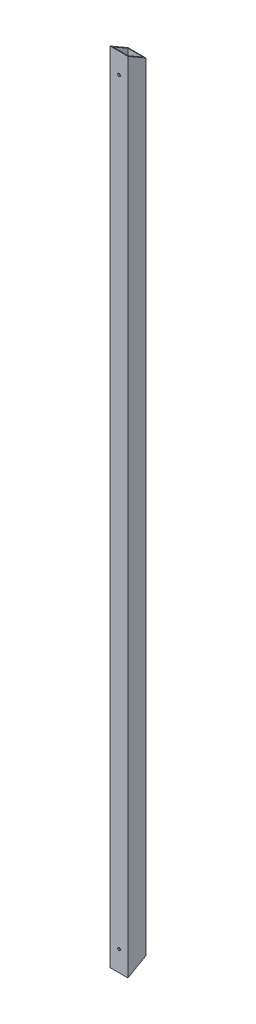
ISO-10303-21;
HEADER;
FILE_DESCRIPTION(('STEP AP214'),'2;1');
FILE_NAME('part.step','',(''),(''),'','','');
FILE_SCHEMA(('AUTOMOTIVE_DESIGN { 1 0 10303 214 1 1 1 1 }'));
ENDSEC;
DATA;
#1=APPLICATION_CONTEXT('core data for automotive mechanical design processes');
#2=APPLICATION_PROTOCOL_DEFINITION('international standard','automotive_design',2000,#1);
#3=PRODUCT_CONTEXT('',#1,'mechanical');
#4=PRODUCT('Part','Part','',(#3));
#5=PRODUCT_RELATED_PRODUCT_CATEGORY('part','',(#4));
#6=PRODUCT_DEFINITION_FORMATION('','',#4);
#7=PRODUCT_DEFINITION_CONTEXT('part definition',#1,'design');
#8=PRODUCT_DEFINITION('design','',#6,#7);
#9=PRODUCT_DEFINITION_SHAPE('','',#8);
#10=(LENGTH_UNIT() NAMED_UNIT(*) SI_UNIT(.MILLI.,.METRE.));
#11=(NAMED_UNIT(*) PLANE_ANGLE_UNIT() SI_UNIT($,.RADIAN.));
#12=(NAMED_UNIT(*) SI_UNIT($,.STERADIAN.) SOLID_ANGLE_UNIT());
#13=UNCERTAINTY_MEASURE_WITH_UNIT(LENGTH_MEASURE(1.E-05),#10,'distance_accuracy_value','');
#14=(GEOMETRIC_REPRESENTATION_CONTEXT(3) GLOBAL_UNCERTAINTY_ASSIGNED_CONTEXT((#13)) GLOBAL_UNIT_ASSIGNED_CONTEXT((#10,
#11,#12)) REPRESENTATION_CONTEXT('',''));
#15=CARTESIAN_POINT('',(0.,0.,0.));
#16=DIRECTION('',(0.,0.,1.));
#17=DIRECTION('',(1.,0.,0.));
#18=AXIS2_PLACEMENT_3D('',#15,#16,#17);
#19=CARTESIAN_POINT('',(-19.0500000000005,-990.092,3.175));
#20=DIRECTION('',(0.,0.,-1.));
#21=DIRECTION('',(-1.,0.,0.));
#22=AXIS2_PLACEMENT_3D('',#19,#20,#21);
#23=PLANE('',#22);
#24=CARTESIAN_POINT('',(-3.60822483003176E-13,939.037999999999,3.175));
#25=DIRECTION('',(0.,0.,-1.));
#26=DIRECTION('',(-1.,0.,0.));
#27=AXIS2_PLACEMENT_3D('',#24,#25,#26);
#28=CIRCLE('',#27,3.37343749999996);
#29=CARTESIAN_POINT('',(-3.37343750000032,939.037999999999,3.175));
#30=VERTEX_POINT('',#29);
#31=EDGE_CURVE('E207',#30,#30,#28,.T.);
#32=ORIENTED_EDGE('',*,*,#31,.T.);
#33=EDGE_LOOP('',(#32));
#34=FACE_BOUND('',#33,.T.);
#35=CARTESIAN_POINT('',(-3.60822483003176E-13,-939.038,3.175));
#36=DIRECTION('',(0.,0.,-1.));
#37=DIRECTION('',(-1.,0.,0.));
#38=AXIS2_PLACEMENT_3D('',#35,#36,#37);
#39=CIRCLE('',#38,3.37343749999996);
#40=CARTESIAN_POINT('',(-3.37343750000032,-939.038,3.175));
#41=VERTEX_POINT('',#40);
#42=EDGE_CURVE('E221',#41,#41,#39,.T.);
#43=ORIENTED_EDGE('',*,*,#42,.T.);
#44=EDGE_LOOP('',(#43));
#45=FACE_BOUND('',#44,.T.);
#46=DIRECTION('',(0.,1.,0.));
#47=VECTOR('',#46,1.);
#48=CARTESIAN_POINT('',(19.0499999999999,-990.092,3.17499999999981));
#49=LINE('',#48,#47);
#50=CARTESIAN_POINT('',(19.0499999999999,-966.261867639198,3.175));
#51=VERTEX_POINT('',#50);
#52=CARTESIAN_POINT('',(19.0499999999999,966.261867639197,3.175));
#53=VERTEX_POINT('',#52);
#54=EDGE_CURVE('E147',#51,#53,#49,.T.);
#55=ORIENTED_EDGE('',*,*,#54,.T.);
#56=DIRECTION('',(-1.,0.,0.));
#57=VECTOR('',#56,1.);
#58=CARTESIAN_POINT('',(-19.0500000000007,966.261867639197,3.175));
#59=LINE('',#58,#57);
#60=CARTESIAN_POINT('',(-19.0500000000005,966.261867639197,3.175));
#61=VERTEX_POINT('',#60);
#62=EDGE_CURVE('E11',#53,#61,#59,.T.);
#63=ORIENTED_EDGE('',*,*,#62,.T.);
#64=DIRECTION('',(0.,1.,0.));
#65=VECTOR('',#64,1.);
#66=CARTESIAN_POINT('',(-19.0500000000005,-990.092,3.175));
#67=LINE('',#66,#65);
#68=CARTESIAN_POINT('',(-19.0500000000005,-966.261867639198,3.175));
#69=VERTEX_POINT('',#68);
#70=EDGE_CURVE('E149',#69,#61,#67,.T.);
#71=ORIENTED_EDGE('',*,*,#70,.F.);
#72=DIRECTION('',(1.,0.,0.));
#73=VECTOR('',#72,1.);
#74=CARTESIAN_POINT('',(-19.0500000000005,-966.261867639198,3.175));
#75=LINE('',#74,#73);
#76=EDGE_CURVE('E47',#69,#51,#75,.T.);
#77=ORIENTED_EDGE('',*,*,#76,.T.);
#78=EDGE_LOOP('',(#55,#63,#71,#77));
#79=FACE_BOUND('',#78,.T.);
#80=ADVANCED_FACE('F38',(#34,#45,#79),#23,.F.);
#81=CARTESIAN_POINT('',(-19.0500000000005,-990.092,3.175));
#82=DIRECTION('',(-1.,0.,0.));
#83=DIRECTION('',(0.,0.,1.));
#84=AXIS2_PLACEMENT_3D('',#81,#82,#83);
#85=PLANE('',#84);
#86=ORIENTED_EDGE('',*,*,#70,.T.);
#87=DIRECTION('',(0.,0.500000000000007,0.866025403784435));
#88=VECTOR('',#87,1.);
#89=CARTESIAN_POINT('',(-19.0500000000005,477.173400729384,-843.95107408375));
#90=LINE('',#89,#88);
#91=CARTESIAN_POINT('',(-19.0500000000005,988.258912895322,41.2749999999999));
#92=VERTEX_POINT('',#91);
#93=EDGE_CURVE('E189',#61,#92,#90,.T.);
#94=ORIENTED_EDGE('',*,*,#93,.T.);
#95=DIRECTION('',(0.,1.,0.));
#96=VECTOR('',#95,1.);
#97=CARTESIAN_POINT('',(-19.0500000000005,-990.092,41.2750000000002));
#98=LINE('',#97,#96);
#99=CARTESIAN_POINT('',(-19.0500000000005,-988.258912895323,41.2750000000002));
#100=VERTEX_POINT('',#99);
#101=EDGE_CURVE('E165',#100,#92,#98,.T.);
#102=ORIENTED_EDGE('',*,*,#101,.F.);
#103=DIRECTION('',(0.,0.500000000000004,-0.866025403784437));
#104=VECTOR('',#103,1.);
#105=CARTESIAN_POINT('',(-19.0500000000001,-972.219400729399,13.4937500000002));
#106=LINE('',#105,#104);
#107=EDGE_CURVE('E198',#100,#69,#106,.T.);
#108=ORIENTED_EDGE('',*,*,#107,.T.);
#109=EDGE_LOOP('',(#86,#94,#102,#108));
#110=FACE_BOUND('',#109,.T.);
#111=ADVANCED_FACE('F261',(#110),#85,.F.);
#112=CARTESIAN_POINT('',(-19.0500000000005,-990.092,41.2750000000002));
#113=DIRECTION('',(0.,0.,1.));
#114=DIRECTION('',(1.,0.,0.));
#115=AXIS2_PLACEMENT_3D('',#112,#113,#114);
#116=PLANE('',#115);
#117=CARTESIAN_POINT('',(-3.60822483003176E-13,939.037999999999,41.275));
#118=DIRECTION('',(0.,0.,1.));
#119=DIRECTION('',(1.,0.,0.));
#120=AXIS2_PLACEMENT_3D('',#117,#118,#119);
#121=CIRCLE('',#120,3.37343749999996);
#122=CARTESIAN_POINT('',(3.3734374999996,939.037999999999,41.275));
#123=VERTEX_POINT('',#122);
#124=EDGE_CURVE('E217',#123,#123,#121,.T.);
#125=ORIENTED_EDGE('',*,*,#124,.T.);
#126=EDGE_LOOP('',(#125));
#127=FACE_BOUND('',#126,.T.);
#128=CARTESIAN_POINT('',(-1.13797860024079E-12,-939.038,41.275));
#129=DIRECTION('',(0.,0.,1.));
#130=DIRECTION('',(1.,0.,0.));
#131=AXIS2_PLACEMENT_3D('',#128,#129,#130);
#132=CIRCLE('',#131,3.37343749999996);
#133=CARTESIAN_POINT('',(3.37343749999882,-939.038,41.275));
#134=VERTEX_POINT('',#133);
#135=EDGE_CURVE('E225',#134,#134,#132,.T.);
#136=ORIENTED_EDGE('',*,*,#135,.T.);
#137=EDGE_LOOP('',(#136));
#138=FACE_BOUND('',#137,.T.);
#139=ORIENTED_EDGE('',*,*,#101,.T.);
#140=DIRECTION('',(1.,0.,0.));
#141=VECTOR('',#140,1.);
#142=CARTESIAN_POINT('',(-19.0500000000007,988.258912895323,41.275));
#143=LINE('',#142,#141);
#144=CARTESIAN_POINT('',(19.0499999999999,988.258912895323,41.275));
#145=VERTEX_POINT('',#144);
#146=EDGE_CURVE('E167',#92,#145,#143,.T.);
#147=ORIENTED_EDGE('',*,*,#146,.T.);
#148=DIRECTION('',(0.,1.,0.));
#149=VECTOR('',#148,1.);
#150=CARTESIAN_POINT('',(19.0499999999999,-990.092,41.275));
#151=LINE('',#150,#149);
#152=CARTESIAN_POINT('',(19.0499999999999,-988.258912895323,41.275));
#153=VERTEX_POINT('',#152);
#154=EDGE_CURVE('E138',#153,#145,#151,.T.);
#155=ORIENTED_EDGE('',*,*,#154,.F.);
#156=DIRECTION('',(-1.,0.,0.));
#157=VECTOR('',#156,1.);
#158=CARTESIAN_POINT('',(-19.0500000000005,-988.258912895323,41.2750000000002));
#159=LINE('',#158,#157);
#160=EDGE_CURVE('E195',#153,#100,#159,.T.);
#161=ORIENTED_EDGE('',*,*,#160,.T.);
#162=EDGE_LOOP('',(#139,#147,#155,#161));
#163=FACE_BOUND('',#162,.T.);
#164=ADVANCED_FACE('F284',(#127,#138,#163),#116,.F.);
#165=CARTESIAN_POINT('',(19.0499999999999,-990.092,3.17499999999981));
#166=DIRECTION('',(1.,0.,0.));
#167=DIRECTION('',(0.,0.,-1.));
#168=AXIS2_PLACEMENT_3D('',#165,#166,#167);
#169=PLANE('',#168);
#170=ORIENTED_EDGE('',*,*,#154,.T.);
#171=DIRECTION('',(0.,-0.500000000000007,-0.866025403784435));
#172=VECTOR('',#171,1.);
#173=CARTESIAN_POINT('',(19.0499999999989,477.173400729384,-843.951074083744));
#174=LINE('',#173,#172);
#175=EDGE_CURVE('E159',#145,#53,#174,.T.);
#176=ORIENTED_EDGE('',*,*,#175,.T.);
#177=ORIENTED_EDGE('',*,*,#54,.F.);
#178=DIRECTION('',(0.,-0.500000000000004,0.866025403784437));
#179=VECTOR('',#178,1.);
#180=CARTESIAN_POINT('',(19.0499999999992,-972.219400729399,13.4937500000002));
#181=LINE('',#180,#179);
#182=EDGE_CURVE('E157',#51,#153,#181,.T.);
#183=ORIENTED_EDGE('',*,*,#182,.T.);
#184=EDGE_LOOP('',(#170,#176,#177,#183));
#185=FACE_BOUND('',#184,.T.);
#186=ADVANCED_FACE('F156',(#185),#169,.F.);
#187=CARTESIAN_POINT('',(-22.2250000000005,-990.092,44.45));
#188=DIRECTION('',(0.,0.866025403784437,0.500000000000004));
#189=DIRECTION('',(0.,-0.500000000000004,0.866025403784437));
#190=AXIS2_PLACEMENT_3D('',#187,#188,#189);
#191=PLANE('',#190);
#192=DIRECTION('',(0.,-0.500000000000004,0.866025403784436));
#193=VECTOR('',#192,1.);
#194=CARTESIAN_POINT('',(22.2250000000001,-990.092,44.45));
#195=LINE('',#194,#193);
#196=CARTESIAN_POINT('',(22.2250000000001,-964.428780534521,1.94289029309402E-13));
#197=VERTEX_POINT('',#196);
#198=CARTESIAN_POINT('',(22.2250000000001,-990.092,44.45));
#199=VERTEX_POINT('',#198);
#200=EDGE_CURVE('E204',#197,#199,#195,.T.);
#201=ORIENTED_EDGE('',*,*,#200,.T.);
#202=DIRECTION('',(1.,0.,0.));
#203=VECTOR('',#202,1.);
#204=CARTESIAN_POINT('',(-22.2250000000003,-990.092,44.45));
#205=LINE('',#204,#203);
#206=CARTESIAN_POINT('',(-22.2250000000005,-990.092,44.45));
#207=VERTEX_POINT('',#206);
#208=EDGE_CURVE('E126',#207,#199,#205,.T.);
#209=ORIENTED_EDGE('',*,*,#208,.F.);
#210=DIRECTION('',(0.,-0.500000000000004,0.866025403784436));
#211=VECTOR('',#210,1.);
#212=CARTESIAN_POINT('',(-22.2250000000005,-990.092,44.45));
#213=LINE('',#212,#211);
#214=CARTESIAN_POINT('',(-22.2250000000003,-964.428780534521,1.94289029309402E-13));
#215=VERTEX_POINT('',#214);
#216=EDGE_CURVE('E54',#215,#207,#213,.T.);
#217=ORIENTED_EDGE('',*,*,#216,.F.);
#218=DIRECTION('',(1.,0.,0.));
#219=VECTOR('',#218,1.);
#220=CARTESIAN_POINT('',(-22.2250000000005,-964.428780534521,1.94289029309402E-13));
#221=LINE('',#220,#219);
#222=EDGE_CURVE('E201',#215,#197,#221,.T.);
#223=ORIENTED_EDGE('',*,*,#222,.T.);
#224=EDGE_LOOP('',(#201,#209,#217,#223));
#225=FACE_BOUND('',#224,.T.);
#226=ORIENTED_EDGE('',*,*,#76,.F.);
#227=ORIENTED_EDGE('',*,*,#107,.F.);
#228=ORIENTED_EDGE('',*,*,#160,.F.);
#229=ORIENTED_EDGE('',*,*,#182,.F.);
#230=EDGE_LOOP('',(#226,#227,#228,#229));
#231=FACE_BOUND('',#230,.T.);
#232=ADVANCED_FACE('F292',(#225,#231),#191,.F.);
#233=CARTESIAN_POINT('',(-22.2250000000007,990.092,44.45));
#234=DIRECTION('',(0.,-0.866025403784435,0.500000000000007));
#235=DIRECTION('',(0.,-0.500000000000007,-0.866025403784435));
#236=AXIS2_PLACEMENT_3D('',#233,#234,#235);
#237=PLANE('',#236);
#238=DIRECTION('',(0.,-0.500000000000007,-0.866025403784435));
#239=VECTOR('',#238,1.);
#240=CARTESIAN_POINT('',(22.2249999999999,990.092,44.45));
#241=LINE('',#240,#239);
#242=CARTESIAN_POINT('',(22.2249999999999,990.092,44.45));
#243=VERTEX_POINT('',#242);
#244=CARTESIAN_POINT('',(22.2249999999999,964.42878053452,0.));
#245=VERTEX_POINT('',#244);
#246=EDGE_CURVE('E62',#243,#245,#241,.T.);
#247=ORIENTED_EDGE('',*,*,#246,.T.);
#248=DIRECTION('',(1.,0.,0.));
#249=VECTOR('',#248,1.);
#250=CARTESIAN_POINT('',(-22.2250000000007,964.42878053452,0.));
#251=LINE('',#250,#249);
#252=CARTESIAN_POINT('',(-22.2250000000007,964.42878053452,0.));
#253=VERTEX_POINT('',#252);
#254=EDGE_CURVE('E107',#253,#245,#251,.T.);
#255=ORIENTED_EDGE('',*,*,#254,.F.);
#256=DIRECTION('',(0.,-0.500000000000007,-0.866025403784435));
#257=VECTOR('',#256,1.);
#258=CARTESIAN_POINT('',(-22.2250000000007,990.092,44.45));
#259=LINE('',#258,#257);
#260=CARTESIAN_POINT('',(-22.2250000000007,990.092,44.45));
#261=VERTEX_POINT('',#260);
#262=EDGE_CURVE('E102',#261,#253,#259,.T.);
#263=ORIENTED_EDGE('',*,*,#262,.F.);
#264=DIRECTION('',(-1.,0.,0.));
#265=VECTOR('',#264,1.);
#266=CARTESIAN_POINT('',(-22.2250000000005,990.092,44.45));
#267=LINE('',#266,#265);
#268=EDGE_CURVE('E106',#243,#261,#267,.T.);
#269=ORIENTED_EDGE('',*,*,#268,.F.);
#270=EDGE_LOOP('',(#247,#255,#263,#269));
#271=FACE_BOUND('',#270,.T.);
#272=ORIENTED_EDGE('',*,*,#146,.F.);
#273=ORIENTED_EDGE('',*,*,#93,.F.);
#274=ORIENTED_EDGE('',*,*,#62,.F.);
#275=ORIENTED_EDGE('',*,*,#175,.F.);
#276=EDGE_LOOP('',(#272,#273,#274,#275));
#277=FACE_BOUND('',#276,.T.);
#278=ADVANCED_FACE('F104',(#271,#277),#237,.F.);
#279=CARTESIAN_POINT('',(22.2249999999999,990.092,44.45));
#280=DIRECTION('',(-1.,0.,0.));
#281=DIRECTION('',(0.,-1.,0.));
#282=AXIS2_PLACEMENT_3D('',#279,#280,#281);
#283=PLANE('',#282);
#284=DIRECTION('',(0.,1.,0.));
#285=VECTOR('',#284,1.);
#286=CARTESIAN_POINT('',(22.2249999999999,990.092,0.));
#287=LINE('',#286,#285);
#288=EDGE_CURVE('E133',#197,#245,#287,.T.);
#289=ORIENTED_EDGE('',*,*,#288,.T.);
#290=ORIENTED_EDGE('',*,*,#246,.F.);
#291=DIRECTION('',(0.,1.,0.));
#292=VECTOR('',#291,1.);
#293=CARTESIAN_POINT('',(22.2249999999999,990.092,44.45));
#294=LINE('',#293,#292);
#295=EDGE_CURVE('E121',#199,#243,#294,.T.);
#296=ORIENTED_EDGE('',*,*,#295,.F.);
#297=ORIENTED_EDGE('',*,*,#200,.F.);
#298=EDGE_LOOP('',(#289,#290,#296,#297));
#299=FACE_BOUND('',#298,.T.);
#300=ADVANCED_FACE('F40',(#299),#283,.F.);
#301=CARTESIAN_POINT('',(-22.2250000000005,990.092,44.45));
#302=DIRECTION('',(1.,0.,0.));
#303=DIRECTION('',(0.,1.,0.));
#304=AXIS2_PLACEMENT_3D('',#301,#302,#303);
#305=PLANE('',#304);
#306=DIRECTION('',(0.,-1.,0.));
#307=VECTOR('',#306,1.);
#308=CARTESIAN_POINT('',(-22.2250000000005,990.092,44.45));
#309=LINE('',#308,#307);
#310=EDGE_CURVE('E119',#261,#207,#309,.T.);
#311=ORIENTED_EDGE('',*,*,#310,.F.);
#312=ORIENTED_EDGE('',*,*,#262,.T.);
#313=DIRECTION('',(0.,-1.,0.));
#314=VECTOR('',#313,1.);
#315=CARTESIAN_POINT('',(-22.2250000000005,990.092,0.));
#316=LINE('',#315,#314);
#317=EDGE_CURVE('E137',#253,#215,#316,.T.);
#318=ORIENTED_EDGE('',*,*,#317,.T.);
#319=ORIENTED_EDGE('',*,*,#216,.T.);
#320=EDGE_LOOP('',(#311,#312,#318,#319));
#321=FACE_BOUND('',#320,.T.);
#322=ADVANCED_FACE('F124',(#321),#305,.F.);
#323=CARTESIAN_POINT('',(0.,0.,44.45));
#324=DIRECTION('',(0.,0.,1.));
#325=DIRECTION('',(1.,0.,0.));
#326=AXIS2_PLACEMENT_3D('',#323,#324,#325);
#327=PLANE('',#326);
#328=CARTESIAN_POINT('',(-3.60822483003176E-13,939.037999999999,44.45));
#329=DIRECTION('',(0.,0.,1.));
#330=DIRECTION('',(1.,0.,0.));
#331=AXIS2_PLACEMENT_3D('',#328,#329,#330);
#332=CIRCLE('',#331,3.37343749999996);
#333=CARTESIAN_POINT('',(3.3734374999996,939.037999999999,44.45));
#334=VERTEX_POINT('',#333);
#335=EDGE_CURVE('E238',#334,#334,#332,.T.);
#336=ORIENTED_EDGE('',*,*,#335,.F.);
#337=EDGE_LOOP('',(#336));
#338=FACE_BOUND('',#337,.T.);
#339=CARTESIAN_POINT('',(-3.60822483003176E-13,-939.038,44.45));
#340=DIRECTION('',(0.,0.,1.));
#341=DIRECTION('',(1.,0.,0.));
#342=AXIS2_PLACEMENT_3D('',#339,#340,#341);
#343=CIRCLE('',#342,3.37343749999996);
#344=CARTESIAN_POINT('',(3.3734374999996,-939.038,44.45));
#345=VERTEX_POINT('',#344);
#346=EDGE_CURVE('E230',#345,#345,#343,.T.);
#347=ORIENTED_EDGE('',*,*,#346,.F.);
#348=EDGE_LOOP('',(#347));
#349=FACE_BOUND('',#348,.T.);
#350=ORIENTED_EDGE('',*,*,#295,.T.);
#351=ORIENTED_EDGE('',*,*,#268,.T.);
#352=ORIENTED_EDGE('',*,*,#310,.T.);
#353=ORIENTED_EDGE('',*,*,#208,.T.);
#354=EDGE_LOOP('',(#350,#351,#352,#353));
#355=FACE_BOUND('',#354,.T.);
#356=ADVANCED_FACE('F117',(#338,#349,#355),#327,.T.);
#357=CARTESIAN_POINT('',(0.,0.,0.));
#358=DIRECTION('',(0.,0.,1.));
#359=DIRECTION('',(1.,0.,0.));
#360=AXIS2_PLACEMENT_3D('',#357,#358,#359);
#361=PLANE('',#360);
#362=CARTESIAN_POINT('',(-3.60822483003176E-13,939.037999999999,0.));
#363=DIRECTION('',(0.,0.,1.));
#364=DIRECTION('',(1.,0.,0.));
#365=AXIS2_PLACEMENT_3D('',#362,#363,#364);
#366=CIRCLE('',#365,3.37343749999996);
#367=CARTESIAN_POINT('',(3.3734374999996,939.037999999999,0.));
#368=VERTEX_POINT('',#367);
#369=EDGE_CURVE('E229',#368,#368,#366,.T.);
#370=ORIENTED_EDGE('',*,*,#369,.T.);
#371=EDGE_LOOP('',(#370));
#372=FACE_BOUND('',#371,.T.);
#373=CARTESIAN_POINT('',(-3.60822483003176E-13,-939.038,0.));
#374=DIRECTION('',(0.,0.,1.));
#375=DIRECTION('',(1.,0.,0.));
#376=AXIS2_PLACEMENT_3D('',#373,#374,#375);
#377=CIRCLE('',#376,3.37343749999996);
#378=CARTESIAN_POINT('',(3.3734374999996,-939.038,0.));
#379=VERTEX_POINT('',#378);
#380=EDGE_CURVE('E234',#379,#379,#377,.T.);
#381=ORIENTED_EDGE('',*,*,#380,.T.);
#382=EDGE_LOOP('',(#381));
#383=FACE_BOUND('',#382,.T.);
#384=ORIENTED_EDGE('',*,*,#317,.F.);
#385=ORIENTED_EDGE('',*,*,#254,.T.);
#386=ORIENTED_EDGE('',*,*,#288,.F.);
#387=ORIENTED_EDGE('',*,*,#222,.F.);
#388=EDGE_LOOP('',(#384,#385,#386,#387));
#389=FACE_BOUND('',#388,.T.);
#390=ADVANCED_FACE('F247',(#372,#383,#389),#361,.F.);
#391=CARTESIAN_POINT('',(-3.60822483003176E-13,-939.038,0.));
#392=DIRECTION('',(0.,0.,1.));
#393=DIRECTION('',(1.,0.,0.));
#394=AXIS2_PLACEMENT_3D('',#391,#392,#393);
#395=CYLINDRICAL_SURFACE('',#394,3.37343749999996);
#396=ORIENTED_EDGE('',*,*,#380,.F.);
#397=EDGE_LOOP('',(#396));
#398=FACE_BOUND('',#397,.T.);
#399=ORIENTED_EDGE('',*,*,#42,.F.);
#400=EDGE_LOOP('',(#399));
#401=FACE_BOUND('',#400,.T.);
#402=ADVANCED_FACE('F254',(#398,#401),#395,.F.);
#403=CARTESIAN_POINT('',(-3.60822483003176E-13,939.037999999999,0.));
#404=DIRECTION('',(0.,0.,1.));
#405=DIRECTION('',(1.,0.,0.));
#406=AXIS2_PLACEMENT_3D('',#403,#404,#405);
#407=CYLINDRICAL_SURFACE('',#406,3.37343749999996);
#408=ORIENTED_EDGE('',*,*,#369,.F.);
#409=EDGE_LOOP('',(#408));
#410=FACE_BOUND('',#409,.T.);
#411=ORIENTED_EDGE('',*,*,#31,.F.);
#412=EDGE_LOOP('',(#411));
#413=FACE_BOUND('',#412,.T.);
#414=ADVANCED_FACE('F250',(#410,#413),#407,.F.);
#415=ORIENTED_EDGE('',*,*,#346,.T.);
#416=EDGE_LOOP('',(#415));
#417=FACE_BOUND('',#416,.T.);
#418=ORIENTED_EDGE('',*,*,#135,.F.);
#419=EDGE_LOOP('',(#418));
#420=FACE_BOUND('',#419,.T.);
#421=ADVANCED_FACE('F253',(#417,#420),#395,.F.);
#422=ORIENTED_EDGE('',*,*,#335,.T.);
#423=EDGE_LOOP('',(#422));
#424=FACE_BOUND('',#423,.T.);
#425=ORIENTED_EDGE('',*,*,#124,.F.);
#426=EDGE_LOOP('',(#425));
#427=FACE_BOUND('',#426,.T.);
#428=ADVANCED_FACE('F256',(#424,#427),#407,.F.);
#429=CLOSED_SHELL('',(#80,#111,#164,#186,#232,#278,#300,#322,#356,#390,#402,#414,#421,#428));
#430=MANIFOLD_SOLID_BREP('B2',#429);
#431=ADVANCED_BREP_SHAPE_REPRESENTATION('',(#18,#430),#14);
#432=SHAPE_DEFINITION_REPRESENTATION(#9,#431);
ENDSEC;
END-ISO-10303-21;
